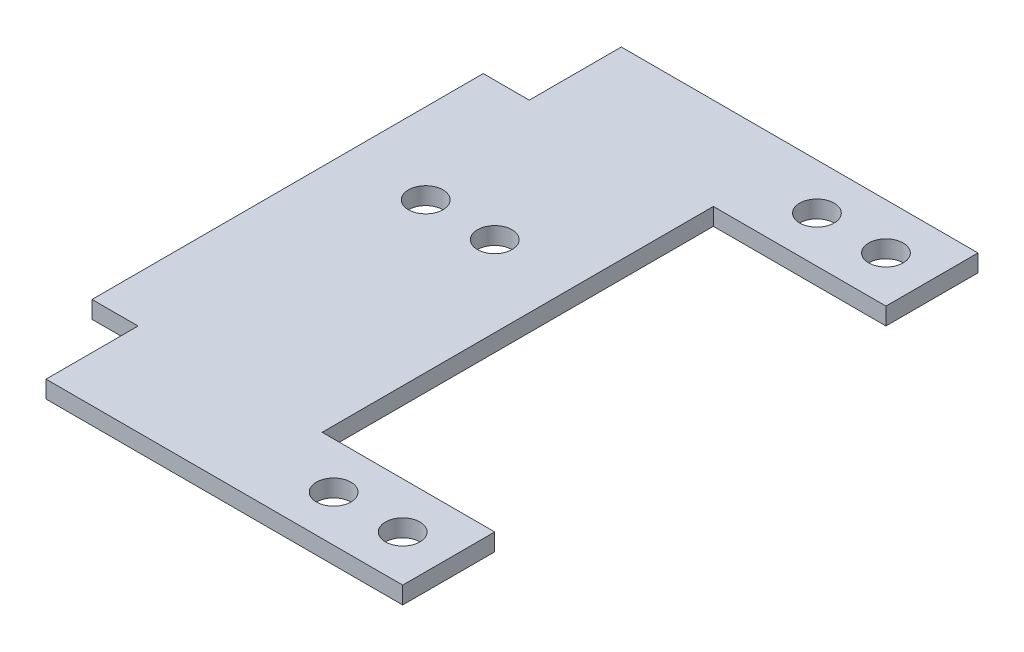
ISO-10303-21;
HEADER;
FILE_DESCRIPTION(('STEP AP214'),'2;1');
FILE_NAME('part.step','',(''),(''),'','','');
FILE_SCHEMA(('AUTOMOTIVE_DESIGN { 1 0 10303 214 1 1 1 1 }'));
ENDSEC;
DATA;
#1=APPLICATION_CONTEXT('core data for automotive mechanical design processes');
#2=APPLICATION_PROTOCOL_DEFINITION('international standard','automotive_design',2000,#1);
#3=PRODUCT_CONTEXT('',#1,'mechanical');
#4=PRODUCT('Part','Part','',(#3));
#5=PRODUCT_RELATED_PRODUCT_CATEGORY('part','',(#4));
#6=PRODUCT_DEFINITION_FORMATION('','',#4);
#7=PRODUCT_DEFINITION_CONTEXT('part definition',#1,'design');
#8=PRODUCT_DEFINITION('design','',#6,#7);
#9=PRODUCT_DEFINITION_SHAPE('','',#8);
#10=(LENGTH_UNIT() NAMED_UNIT(*) SI_UNIT(.MILLI.,.METRE.));
#11=(NAMED_UNIT(*) PLANE_ANGLE_UNIT() SI_UNIT($,.RADIAN.));
#12=(NAMED_UNIT(*) SI_UNIT($,.STERADIAN.) SOLID_ANGLE_UNIT());
#13=UNCERTAINTY_MEASURE_WITH_UNIT(LENGTH_MEASURE(1.E-05),#10,'distance_accuracy_value','');
#14=(GEOMETRIC_REPRESENTATION_CONTEXT(3) GLOBAL_UNCERTAINTY_ASSIGNED_CONTEXT((#13)) GLOBAL_UNIT_ASSIGNED_CONTEXT((#10,
#11,#12)) REPRESENTATION_CONTEXT('',''));
#15=CARTESIAN_POINT('',(0.,0.,0.));
#16=DIRECTION('',(0.,0.,1.));
#17=DIRECTION('',(1.,0.,0.));
#18=AXIS2_PLACEMENT_3D('',#15,#16,#17);
#19=CARTESIAN_POINT('',(-10.,1.5,-17.));
#20=DIRECTION('',(0.,0.,1.));
#21=DIRECTION('',(1.,0.,0.));
#22=AXIS2_PLACEMENT_3D('',#19,#20,#21);
#23=PLANE('',#22);
#24=DIRECTION('',(0.,1.,0.));
#25=VECTOR('',#24,1.);
#26=CARTESIAN_POINT('',(-6.,0.,-17.));
#27=LINE('',#26,#25);
#28=CARTESIAN_POINT('',(-6.,0.,-17.));
#29=VERTEX_POINT('',#28);
#30=CARTESIAN_POINT('',(-6.,1.5,-17.));
#31=VERTEX_POINT('',#30);
#32=EDGE_CURVE('E56',#29,#31,#27,.T.);
#33=ORIENTED_EDGE('',*,*,#32,.F.);
#34=DIRECTION('',(-1.,0.,0.));
#35=VECTOR('',#34,1.);
#36=CARTESIAN_POINT('',(-10.,0.,-17.));
#37=LINE('',#36,#35);
#38=CARTESIAN_POINT('',(-10.,0.,-17.));
#39=VERTEX_POINT('',#38);
#40=EDGE_CURVE('E150',#29,#39,#37,.T.);
#41=ORIENTED_EDGE('',*,*,#40,.T.);
#42=DIRECTION('',(0.,-1.,0.));
#43=VECTOR('',#42,1.);
#44=CARTESIAN_POINT('',(-10.,1.5,-17.));
#45=LINE('',#44,#43);
#46=CARTESIAN_POINT('',(-10.,1.5,-17.));
#47=VERTEX_POINT('',#46);
#48=EDGE_CURVE('E48',#47,#39,#45,.T.);
#49=ORIENTED_EDGE('',*,*,#48,.F.);
#50=DIRECTION('',(-1.,0.,0.));
#51=VECTOR('',#50,1.);
#52=CARTESIAN_POINT('',(-10.,1.5,-17.));
#53=LINE('',#52,#51);
#54=EDGE_CURVE('E208',#31,#47,#53,.T.);
#55=ORIENTED_EDGE('',*,*,#54,.F.);
#56=EDGE_LOOP('',(#33,#41,#49,#55));
#57=FACE_BOUND('',#56,.T.);
#58=ADVANCED_FACE('F39',(#57),#23,.F.);
#59=CARTESIAN_POINT('',(9.99999999999999,1.5,-17.));
#60=DIRECTION('',(-1.,0.,0.));
#61=DIRECTION('',(0.,0.,1.));
#62=AXIS2_PLACEMENT_3D('',#59,#60,#61);
#63=PLANE('',#62);
#64=DIRECTION('',(0.,0.,-1.));
#65=VECTOR('',#64,1.);
#66=CARTESIAN_POINT('',(9.99999999999999,0.,-17.));
#67=LINE('',#66,#65);
#68=CARTESIAN_POINT('',(10.,0.,17.));
#69=VERTEX_POINT('',#68);
#70=CARTESIAN_POINT('',(9.99999999999999,0.,-17.));
#71=VERTEX_POINT('',#70);
#72=EDGE_CURVE('E200',#69,#71,#67,.T.);
#73=ORIENTED_EDGE('',*,*,#72,.T.);
#74=DIRECTION('',(0.,-1.,0.));
#75=VECTOR('',#74,1.);
#76=CARTESIAN_POINT('',(9.99999999999999,1.5,-17.));
#77=LINE('',#76,#75);
#78=CARTESIAN_POINT('',(9.99999999999999,1.5,-17.));
#79=VERTEX_POINT('',#78);
#80=EDGE_CURVE('E11',#79,#71,#77,.T.);
#81=ORIENTED_EDGE('',*,*,#80,.F.);
#82=DIRECTION('',(0.,0.,-1.));
#83=VECTOR('',#82,1.);
#84=CARTESIAN_POINT('',(9.99999999999999,1.5,-17.));
#85=LINE('',#84,#83);
#86=CARTESIAN_POINT('',(10.,1.5,17.));
#87=VERTEX_POINT('',#86);
#88=EDGE_CURVE('E206',#87,#79,#85,.T.);
#89=ORIENTED_EDGE('',*,*,#88,.F.);
#90=DIRECTION('',(0.,-1.,0.));
#91=VECTOR('',#90,1.);
#92=CARTESIAN_POINT('',(10.,1.5,17.));
#93=LINE('',#92,#91);
#94=EDGE_CURVE('E216',#87,#69,#93,.T.);
#95=ORIENTED_EDGE('',*,*,#94,.T.);
#96=EDGE_LOOP('',(#73,#81,#89,#95));
#97=FACE_BOUND('',#96,.T.);
#98=ADVANCED_FACE('F41',(#97),#63,.F.);
#99=CARTESIAN_POINT('',(-10.,1.5,-17.));
#100=DIRECTION('',(1.,0.,0.));
#101=DIRECTION('',(0.,0.,-1.));
#102=AXIS2_PLACEMENT_3D('',#99,#100,#101);
#103=PLANE('',#102);
#104=DIRECTION('',(0.,0.,1.));
#105=VECTOR('',#104,1.);
#106=CARTESIAN_POINT('',(-10.,0.,-17.));
#107=LINE('',#106,#105);
#108=CARTESIAN_POINT('',(-10.,0.,17.));
#109=VERTEX_POINT('',#108);
#110=EDGE_CURVE('E219',#39,#109,#107,.T.);
#111=ORIENTED_EDGE('',*,*,#110,.T.);
#112=DIRECTION('',(0.,-1.,0.));
#113=VECTOR('',#112,1.);
#114=CARTESIAN_POINT('',(-10.,1.5,17.));
#115=LINE('',#114,#113);
#116=CARTESIAN_POINT('',(-10.,1.5,17.));
#117=VERTEX_POINT('',#116);
#118=EDGE_CURVE('E225',#117,#109,#115,.T.);
#119=ORIENTED_EDGE('',*,*,#118,.F.);
#120=DIRECTION('',(0.,0.,1.));
#121=VECTOR('',#120,1.);
#122=CARTESIAN_POINT('',(-10.,1.5,-17.));
#123=LINE('',#122,#121);
#124=EDGE_CURVE('E211',#47,#117,#123,.T.);
#125=ORIENTED_EDGE('',*,*,#124,.F.);
#126=ORIENTED_EDGE('',*,*,#48,.T.);
#127=EDGE_LOOP('',(#111,#119,#125,#126));
#128=FACE_BOUND('',#127,.T.);
#129=ADVANCED_FACE('F297',(#128),#103,.F.);
#130=CARTESIAN_POINT('',(-10.,1.5,17.));
#131=DIRECTION('',(0.,0.,-1.));
#132=DIRECTION('',(-1.,0.,0.));
#133=AXIS2_PLACEMENT_3D('',#130,#131,#132);
#134=PLANE('',#133);
#135=DIRECTION('',(1.,0.,0.));
#136=VECTOR('',#135,1.);
#137=CARTESIAN_POINT('',(-10.,0.,17.));
#138=LINE('',#137,#136);
#139=CARTESIAN_POINT('',(-6.,0.,17.));
#140=VERTEX_POINT('',#139);
#141=EDGE_CURVE('E209',#109,#140,#138,.T.);
#142=ORIENTED_EDGE('',*,*,#141,.T.);
#143=DIRECTION('',(0.,1.,0.));
#144=VECTOR('',#143,1.);
#145=CARTESIAN_POINT('',(-6.,0.,17.));
#146=LINE('',#145,#144);
#147=CARTESIAN_POINT('',(-6.,1.5,17.));
#148=VERTEX_POINT('',#147);
#149=EDGE_CURVE('E189',#140,#148,#146,.T.);
#150=ORIENTED_EDGE('',*,*,#149,.T.);
#151=DIRECTION('',(1.,0.,0.));
#152=VECTOR('',#151,1.);
#153=CARTESIAN_POINT('',(-10.,1.5,17.));
#154=LINE('',#153,#152);
#155=EDGE_CURVE('E213',#117,#148,#154,.T.);
#156=ORIENTED_EDGE('',*,*,#155,.F.);
#157=ORIENTED_EDGE('',*,*,#118,.T.);
#158=EDGE_LOOP('',(#142,#150,#156,#157));
#159=FACE_BOUND('',#158,.T.);
#160=ADVANCED_FACE('F274',(#159),#134,.F.);
#161=CARTESIAN_POINT('',(0.,1.5,0.));
#162=DIRECTION('',(0.,1.,0.));
#163=DIRECTION('',(0.,0.,1.));
#164=AXIS2_PLACEMENT_3D('',#161,#162,#163);
#165=PLANE('',#164);
#166=CARTESIAN_POINT('',(21.,1.5,21.));
#167=DIRECTION('',(0.,1.,0.));
#168=DIRECTION('',(0.,0.,1.));
#169=AXIS2_PLACEMENT_3D('',#166,#167,#168);
#170=CIRCLE('',#169,1.5);
#171=CARTESIAN_POINT('',(21.,1.5,22.5));
#172=VERTEX_POINT('',#171);
#173=EDGE_CURVE('E259',#172,#172,#170,.T.);
#174=ORIENTED_EDGE('',*,*,#173,.F.);
#175=EDGE_LOOP('',(#174));
#176=FACE_BOUND('',#175,.T.);
#177=CARTESIAN_POINT('',(15.,1.5,21.));
#178=DIRECTION('',(0.,1.,0.));
#179=DIRECTION('',(0.,0.,1.));
#180=AXIS2_PLACEMENT_3D('',#177,#178,#179);
#181=CIRCLE('',#180,1.5);
#182=CARTESIAN_POINT('',(15.,1.5,22.5));
#183=VERTEX_POINT('',#182);
#184=EDGE_CURVE('E262',#183,#183,#181,.T.);
#185=ORIENTED_EDGE('',*,*,#184,.F.);
#186=EDGE_LOOP('',(#185));
#187=FACE_BOUND('',#186,.T.);
#188=CARTESIAN_POINT('',(15.,1.5,-21.));
#189=DIRECTION('',(0.,1.,0.));
#190=DIRECTION('',(0.,0.,1.));
#191=AXIS2_PLACEMENT_3D('',#188,#189,#190);
#192=CIRCLE('',#191,1.5);
#193=CARTESIAN_POINT('',(15.,1.5,-19.5));
#194=VERTEX_POINT('',#193);
#195=EDGE_CURVE('E258',#194,#194,#192,.T.);
#196=ORIENTED_EDGE('',*,*,#195,.F.);
#197=EDGE_LOOP('',(#196));
#198=FACE_BOUND('',#197,.T.);
#199=CARTESIAN_POINT('',(21.,1.5,-21.));
#200=DIRECTION('',(0.,1.,0.));
#201=DIRECTION('',(0.,0.,1.));
#202=AXIS2_PLACEMENT_3D('',#199,#200,#201);
#203=CIRCLE('',#202,1.5);
#204=CARTESIAN_POINT('',(21.,1.5,-19.5));
#205=VERTEX_POINT('',#204);
#206=EDGE_CURVE('E240',#205,#205,#203,.T.);
#207=ORIENTED_EDGE('',*,*,#206,.F.);
#208=EDGE_LOOP('',(#207));
#209=FACE_BOUND('',#208,.T.);
#210=CARTESIAN_POINT('',(-3.,1.5,-5.));
#211=DIRECTION('',(0.,1.,0.));
#212=DIRECTION('',(0.,0.,1.));
#213=AXIS2_PLACEMENT_3D('',#210,#211,#212);
#214=CIRCLE('',#213,1.5);
#215=CARTESIAN_POINT('',(-3.,1.5,-3.5));
#216=VERTEX_POINT('',#215);
#217=EDGE_CURVE('E233',#216,#216,#214,.T.);
#218=ORIENTED_EDGE('',*,*,#217,.F.);
#219=EDGE_LOOP('',(#218));
#220=FACE_BOUND('',#219,.T.);
#221=CARTESIAN_POINT('',(3.,1.5,-5.));
#222=DIRECTION('',(0.,1.,0.));
#223=DIRECTION('',(0.,0.,1.));
#224=AXIS2_PLACEMENT_3D('',#221,#222,#223);
#225=CIRCLE('',#224,1.5);
#226=CARTESIAN_POINT('',(3.,1.5,-3.5));
#227=VERTEX_POINT('',#226);
#228=EDGE_CURVE('E161',#227,#227,#225,.T.);
#229=ORIENTED_EDGE('',*,*,#228,.F.);
#230=EDGE_LOOP('',(#229));
#231=FACE_BOUND('',#230,.T.);
#232=ORIENTED_EDGE('',*,*,#88,.T.);
#233=DIRECTION('',(1.,0.,0.));
#234=VECTOR('',#233,1.);
#235=CARTESIAN_POINT('',(-6.,1.5,-17.));
#236=LINE('',#235,#234);
#237=CARTESIAN_POINT('',(25.,1.5,-17.));
#238=VERTEX_POINT('',#237);
#239=EDGE_CURVE('E158',#79,#238,#236,.T.);
#240=ORIENTED_EDGE('',*,*,#239,.T.);
#241=DIRECTION('',(0.,0.,-1.));
#242=VECTOR('',#241,1.);
#243=CARTESIAN_POINT('',(25.,1.5,-25.));
#244=LINE('',#243,#242);
#245=CARTESIAN_POINT('',(25.,1.5,-25.));
#246=VERTEX_POINT('',#245);
#247=EDGE_CURVE('E155',#238,#246,#244,.T.);
#248=ORIENTED_EDGE('',*,*,#247,.T.);
#249=DIRECTION('',(-1.,0.,0.));
#250=VECTOR('',#249,1.);
#251=CARTESIAN_POINT('',(-6.,1.5,-25.));
#252=LINE('',#251,#250);
#253=CARTESIAN_POINT('',(-6.,1.5,-25.));
#254=VERTEX_POINT('',#253);
#255=EDGE_CURVE('E166',#246,#254,#252,.T.);
#256=ORIENTED_EDGE('',*,*,#255,.T.);
#257=DIRECTION('',(0.,0.,1.));
#258=VECTOR('',#257,1.);
#259=CARTESIAN_POINT('',(-6.,1.5,-17.));
#260=LINE('',#259,#258);
#261=EDGE_CURVE('E135',#254,#31,#260,.T.);
#262=ORIENTED_EDGE('',*,*,#261,.T.);
#263=ORIENTED_EDGE('',*,*,#54,.T.);
#264=ORIENTED_EDGE('',*,*,#124,.T.);
#265=ORIENTED_EDGE('',*,*,#155,.T.);
#266=DIRECTION('',(0.,0.,1.));
#267=VECTOR('',#266,1.);
#268=CARTESIAN_POINT('',(-6.,1.5,17.));
#269=LINE('',#268,#267);
#270=CARTESIAN_POINT('',(-6.,1.5,25.));
#271=VERTEX_POINT('',#270);
#272=EDGE_CURVE('E64',#148,#271,#269,.T.);
#273=ORIENTED_EDGE('',*,*,#272,.T.);
#274=DIRECTION('',(1.,0.,0.));
#275=VECTOR('',#274,1.);
#276=CARTESIAN_POINT('',(-6.,1.5,25.));
#277=LINE('',#276,#275);
#278=CARTESIAN_POINT('',(25.,1.5,25.));
#279=VERTEX_POINT('',#278);
#280=EDGE_CURVE('E193',#271,#279,#277,.T.);
#281=ORIENTED_EDGE('',*,*,#280,.T.);
#282=DIRECTION('',(0.,0.,-1.));
#283=VECTOR('',#282,1.);
#284=CARTESIAN_POINT('',(25.,1.5,25.));
#285=LINE('',#284,#283);
#286=CARTESIAN_POINT('',(25.,1.5,17.));
#287=VERTEX_POINT('',#286);
#288=EDGE_CURVE('E180',#279,#287,#285,.T.);
#289=ORIENTED_EDGE('',*,*,#288,.T.);
#290=DIRECTION('',(-1.,0.,0.));
#291=VECTOR('',#290,1.);
#292=CARTESIAN_POINT('',(-6.,1.5,17.));
#293=LINE('',#292,#291);
#294=EDGE_CURVE('E172',#287,#87,#293,.T.);
#295=ORIENTED_EDGE('',*,*,#294,.T.);
#296=EDGE_LOOP('',(#232,#240,#248,#256,#262,#263,#264,#265,#273,#281,#289,#295));
#297=FACE_BOUND('',#296,.T.);
#298=ADVANCED_FACE('F271',(#176,#187,#198,#209,#220,#231,#297),#165,.T.);
#299=CARTESIAN_POINT('',(0.,0.,0.));
#300=DIRECTION('',(0.,1.,0.));
#301=DIRECTION('',(0.,0.,1.));
#302=AXIS2_PLACEMENT_3D('',#299,#300,#301);
#303=PLANE('',#302);
#304=CARTESIAN_POINT('',(21.,0.,21.));
#305=DIRECTION('',(0.,1.,0.));
#306=DIRECTION('',(0.,0.,1.));
#307=AXIS2_PLACEMENT_3D('',#304,#305,#306);
#308=CIRCLE('',#307,1.5);
#309=CARTESIAN_POINT('',(21.,0.,22.5));
#310=VERTEX_POINT('',#309);
#311=EDGE_CURVE('E43',#310,#310,#308,.T.);
#312=ORIENTED_EDGE('',*,*,#311,.T.);
#313=EDGE_LOOP('',(#312));
#314=FACE_BOUND('',#313,.T.);
#315=CARTESIAN_POINT('',(15.,0.,21.));
#316=DIRECTION('',(0.,1.,0.));
#317=DIRECTION('',(0.,0.,1.));
#318=AXIS2_PLACEMENT_3D('',#315,#316,#317);
#319=CIRCLE('',#318,1.5);
#320=CARTESIAN_POINT('',(15.,0.,22.5));
#321=VERTEX_POINT('',#320);
#322=EDGE_CURVE('E242',#321,#321,#319,.T.);
#323=ORIENTED_EDGE('',*,*,#322,.T.);
#324=EDGE_LOOP('',(#323));
#325=FACE_BOUND('',#324,.T.);
#326=CARTESIAN_POINT('',(15.,0.,-21.));
#327=DIRECTION('',(0.,1.,0.));
#328=DIRECTION('',(0.,0.,1.));
#329=AXIS2_PLACEMENT_3D('',#326,#327,#328);
#330=CIRCLE('',#329,1.5);
#331=CARTESIAN_POINT('',(15.,0.,-19.5));
#332=VERTEX_POINT('',#331);
#333=EDGE_CURVE('E239',#332,#332,#330,.T.);
#334=ORIENTED_EDGE('',*,*,#333,.T.);
#335=EDGE_LOOP('',(#334));
#336=FACE_BOUND('',#335,.T.);
#337=CARTESIAN_POINT('',(21.,0.,-21.));
#338=DIRECTION('',(0.,1.,0.));
#339=DIRECTION('',(0.,0.,1.));
#340=AXIS2_PLACEMENT_3D('',#337,#338,#339);
#341=CIRCLE('',#340,1.5);
#342=CARTESIAN_POINT('',(21.,0.,-19.5));
#343=VERTEX_POINT('',#342);
#344=EDGE_CURVE('E236',#343,#343,#341,.T.);
#345=ORIENTED_EDGE('',*,*,#344,.T.);
#346=EDGE_LOOP('',(#345));
#347=FACE_BOUND('',#346,.T.);
#348=CARTESIAN_POINT('',(-3.,0.,-5.));
#349=DIRECTION('',(0.,1.,0.));
#350=DIRECTION('',(0.,0.,1.));
#351=AXIS2_PLACEMENT_3D('',#348,#349,#350);
#352=CIRCLE('',#351,1.5);
#353=CARTESIAN_POINT('',(-3.,0.,-3.5));
#354=VERTEX_POINT('',#353);
#355=EDGE_CURVE('E168',#354,#354,#352,.T.);
#356=ORIENTED_EDGE('',*,*,#355,.T.);
#357=EDGE_LOOP('',(#356));
#358=FACE_BOUND('',#357,.T.);
#359=CARTESIAN_POINT('',(3.,0.,-5.));
#360=DIRECTION('',(0.,1.,0.));
#361=DIRECTION('',(0.,0.,1.));
#362=AXIS2_PLACEMENT_3D('',#359,#360,#361);
#363=CIRCLE('',#362,1.5);
#364=CARTESIAN_POINT('',(3.,0.,-3.5));
#365=VERTEX_POINT('',#364);
#366=EDGE_CURVE('E230',#365,#365,#363,.T.);
#367=ORIENTED_EDGE('',*,*,#366,.T.);
#368=EDGE_LOOP('',(#367));
#369=FACE_BOUND('',#368,.T.);
#370=ORIENTED_EDGE('',*,*,#72,.F.);
#371=DIRECTION('',(-1.,0.,0.));
#372=VECTOR('',#371,1.);
#373=CARTESIAN_POINT('',(-6.,0.,17.));
#374=LINE('',#373,#372);
#375=CARTESIAN_POINT('',(25.,0.,17.));
#376=VERTEX_POINT('',#375);
#377=EDGE_CURVE('E177',#376,#69,#374,.T.);
#378=ORIENTED_EDGE('',*,*,#377,.F.);
#379=DIRECTION('',(0.,0.,-1.));
#380=VECTOR('',#379,1.);
#381=CARTESIAN_POINT('',(25.,0.,25.));
#382=LINE('',#381,#380);
#383=CARTESIAN_POINT('',(25.,0.,25.));
#384=VERTEX_POINT('',#383);
#385=EDGE_CURVE('E186',#384,#376,#382,.T.);
#386=ORIENTED_EDGE('',*,*,#385,.F.);
#387=DIRECTION('',(1.,0.,0.));
#388=VECTOR('',#387,1.);
#389=CARTESIAN_POINT('',(-6.,0.,25.));
#390=LINE('',#389,#388);
#391=CARTESIAN_POINT('',(-6.,0.,25.));
#392=VERTEX_POINT('',#391);
#393=EDGE_CURVE('E183',#392,#384,#390,.T.);
#394=ORIENTED_EDGE('',*,*,#393,.F.);
#395=DIRECTION('',(0.,0.,1.));
#396=VECTOR('',#395,1.);
#397=CARTESIAN_POINT('',(-6.,0.,17.));
#398=LINE('',#397,#396);
#399=EDGE_CURVE('E179',#140,#392,#398,.T.);
#400=ORIENTED_EDGE('',*,*,#399,.F.);
#401=ORIENTED_EDGE('',*,*,#141,.F.);
#402=ORIENTED_EDGE('',*,*,#110,.F.);
#403=ORIENTED_EDGE('',*,*,#40,.F.);
#404=DIRECTION('',(0.,0.,1.));
#405=VECTOR('',#404,1.);
#406=CARTESIAN_POINT('',(-6.,0.,-17.));
#407=LINE('',#406,#405);
#408=CARTESIAN_POINT('',(-6.,0.,-25.));
#409=VERTEX_POINT('',#408);
#410=EDGE_CURVE('E133',#409,#29,#407,.T.);
#411=ORIENTED_EDGE('',*,*,#410,.F.);
#412=DIRECTION('',(-1.,0.,0.));
#413=VECTOR('',#412,1.);
#414=CARTESIAN_POINT('',(-6.,0.,-25.));
#415=LINE('',#414,#413);
#416=CARTESIAN_POINT('',(25.,0.,-25.));
#417=VERTEX_POINT('',#416);
#418=EDGE_CURVE('E147',#417,#409,#415,.T.);
#419=ORIENTED_EDGE('',*,*,#418,.F.);
#420=DIRECTION('',(0.,0.,-1.));
#421=VECTOR('',#420,1.);
#422=CARTESIAN_POINT('',(25.,0.,-25.));
#423=LINE('',#422,#421);
#424=CARTESIAN_POINT('',(25.,0.,-17.));
#425=VERTEX_POINT('',#424);
#426=EDGE_CURVE('E140',#425,#417,#423,.T.);
#427=ORIENTED_EDGE('',*,*,#426,.F.);
#428=DIRECTION('',(1.,0.,0.));
#429=VECTOR('',#428,1.);
#430=CARTESIAN_POINT('',(-6.,0.,-17.));
#431=LINE('',#430,#429);
#432=EDGE_CURVE('E151',#71,#425,#431,.T.);
#433=ORIENTED_EDGE('',*,*,#432,.F.);
#434=EDGE_LOOP('',(#370,#378,#386,#394,#400,#401,#402,#403,#411,#419,#427,#433));
#435=FACE_BOUND('',#434,.T.);
#436=ADVANCED_FACE('F145',(#314,#325,#336,#347,#358,#369,#435),#303,.F.);
#437=CARTESIAN_POINT('',(-6.,0.,17.));
#438=DIRECTION('',(0.,0.,-1.));
#439=DIRECTION('',(-1.,0.,0.));
#440=AXIS2_PLACEMENT_3D('',#437,#438,#439);
#441=PLANE('',#440);
#442=ORIENTED_EDGE('',*,*,#94,.F.);
#443=ORIENTED_EDGE('',*,*,#294,.F.);
#444=DIRECTION('',(0.,1.,0.));
#445=VECTOR('',#444,1.);
#446=CARTESIAN_POINT('',(25.,0.,17.));
#447=LINE('',#446,#445);
#448=EDGE_CURVE('E198',#376,#287,#447,.T.);
#449=ORIENTED_EDGE('',*,*,#448,.F.);
#450=ORIENTED_EDGE('',*,*,#377,.T.);
#451=EDGE_LOOP('',(#442,#443,#449,#450));
#452=FACE_BOUND('',#451,.T.);
#453=ADVANCED_FACE('F309',(#452),#441,.T.);
#454=CARTESIAN_POINT('',(25.,0.,25.));
#455=DIRECTION('',(1.,0.,0.));
#456=DIRECTION('',(0.,0.,-1.));
#457=AXIS2_PLACEMENT_3D('',#454,#455,#456);
#458=PLANE('',#457);
#459=ORIENTED_EDGE('',*,*,#288,.F.);
#460=DIRECTION('',(0.,1.,0.));
#461=VECTOR('',#460,1.);
#462=CARTESIAN_POINT('',(25.,0.,25.));
#463=LINE('',#462,#461);
#464=EDGE_CURVE('E201',#384,#279,#463,.T.);
#465=ORIENTED_EDGE('',*,*,#464,.F.);
#466=ORIENTED_EDGE('',*,*,#385,.T.);
#467=ORIENTED_EDGE('',*,*,#448,.T.);
#468=EDGE_LOOP('',(#459,#465,#466,#467));
#469=FACE_BOUND('',#468,.T.);
#470=ADVANCED_FACE('F305',(#469),#458,.T.);
#471=CARTESIAN_POINT('',(-6.,0.,25.));
#472=DIRECTION('',(0.,0.,1.));
#473=DIRECTION('',(1.,0.,0.));
#474=AXIS2_PLACEMENT_3D('',#471,#472,#473);
#475=PLANE('',#474);
#476=ORIENTED_EDGE('',*,*,#280,.F.);
#477=DIRECTION('',(0.,1.,0.));
#478=VECTOR('',#477,1.);
#479=CARTESIAN_POINT('',(-6.,0.,25.));
#480=LINE('',#479,#478);
#481=EDGE_CURVE('E203',#392,#271,#480,.T.);
#482=ORIENTED_EDGE('',*,*,#481,.F.);
#483=ORIENTED_EDGE('',*,*,#393,.T.);
#484=ORIENTED_EDGE('',*,*,#464,.T.);
#485=EDGE_LOOP('',(#476,#482,#483,#484));
#486=FACE_BOUND('',#485,.T.);
#487=ADVANCED_FACE('F313',(#486),#475,.T.);
#488=CARTESIAN_POINT('',(-6.,0.,17.));
#489=DIRECTION('',(-1.,0.,0.));
#490=DIRECTION('',(0.,0.,1.));
#491=AXIS2_PLACEMENT_3D('',#488,#489,#490);
#492=PLANE('',#491);
#493=ORIENTED_EDGE('',*,*,#272,.F.);
#494=ORIENTED_EDGE('',*,*,#149,.F.);
#495=ORIENTED_EDGE('',*,*,#399,.T.);
#496=ORIENTED_EDGE('',*,*,#481,.T.);
#497=EDGE_LOOP('',(#493,#494,#495,#496));
#498=FACE_BOUND('',#497,.T.);
#499=ADVANCED_FACE('F312',(#498),#492,.T.);
#500=CARTESIAN_POINT('',(-6.,0.,-25.));
#501=DIRECTION('',(0.,0.,-1.));
#502=DIRECTION('',(-1.,0.,0.));
#503=AXIS2_PLACEMENT_3D('',#500,#501,#502);
#504=PLANE('',#503);
#505=ORIENTED_EDGE('',*,*,#255,.F.);
#506=DIRECTION('',(0.,1.,0.));
#507=VECTOR('',#506,1.);
#508=CARTESIAN_POINT('',(25.,0.,-25.));
#509=LINE('',#508,#507);
#510=EDGE_CURVE('E154',#417,#246,#509,.T.);
#511=ORIENTED_EDGE('',*,*,#510,.F.);
#512=ORIENTED_EDGE('',*,*,#418,.T.);
#513=DIRECTION('',(0.,1.,0.));
#514=VECTOR('',#513,1.);
#515=CARTESIAN_POINT('',(-6.,0.,-25.));
#516=LINE('',#515,#514);
#517=EDGE_CURVE('E130',#409,#254,#516,.T.);
#518=ORIENTED_EDGE('',*,*,#517,.T.);
#519=EDGE_LOOP('',(#505,#511,#512,#518));
#520=FACE_BOUND('',#519,.T.);
#521=ADVANCED_FACE('F153',(#520),#504,.T.);
#522=CARTESIAN_POINT('',(25.,0.,-25.));
#523=DIRECTION('',(1.,0.,0.));
#524=DIRECTION('',(0.,0.,-1.));
#525=AXIS2_PLACEMENT_3D('',#522,#523,#524);
#526=PLANE('',#525);
#527=ORIENTED_EDGE('',*,*,#247,.F.);
#528=DIRECTION('',(0.,1.,0.));
#529=VECTOR('',#528,1.);
#530=CARTESIAN_POINT('',(25.,0.,-17.));
#531=LINE('',#530,#529);
#532=EDGE_CURVE('E173',#425,#238,#531,.T.);
#533=ORIENTED_EDGE('',*,*,#532,.F.);
#534=ORIENTED_EDGE('',*,*,#426,.T.);
#535=ORIENTED_EDGE('',*,*,#510,.T.);
#536=EDGE_LOOP('',(#527,#533,#534,#535));
#537=FACE_BOUND('',#536,.T.);
#538=ADVANCED_FACE('F292',(#537),#526,.T.);
#539=CARTESIAN_POINT('',(-6.,0.,-17.));
#540=DIRECTION('',(0.,0.,1.));
#541=DIRECTION('',(1.,0.,0.));
#542=AXIS2_PLACEMENT_3D('',#539,#540,#541);
#543=PLANE('',#542);
#544=ORIENTED_EDGE('',*,*,#239,.F.);
#545=ORIENTED_EDGE('',*,*,#80,.T.);
#546=ORIENTED_EDGE('',*,*,#432,.T.);
#547=ORIENTED_EDGE('',*,*,#532,.T.);
#548=EDGE_LOOP('',(#544,#545,#546,#547));
#549=FACE_BOUND('',#548,.T.);
#550=ADVANCED_FACE('F288',(#549),#543,.T.);
#551=CARTESIAN_POINT('',(-6.,0.,-17.));
#552=DIRECTION('',(-1.,0.,0.));
#553=DIRECTION('',(0.,0.,1.));
#554=AXIS2_PLACEMENT_3D('',#551,#552,#553);
#555=PLANE('',#554);
#556=ORIENTED_EDGE('',*,*,#261,.F.);
#557=ORIENTED_EDGE('',*,*,#517,.F.);
#558=ORIENTED_EDGE('',*,*,#410,.T.);
#559=ORIENTED_EDGE('',*,*,#32,.T.);
#560=EDGE_LOOP('',(#556,#557,#558,#559));
#561=FACE_BOUND('',#560,.T.);
#562=ADVANCED_FACE('F132',(#561),#555,.T.);
#563=CARTESIAN_POINT('',(3.,-8.5,-5.));
#564=DIRECTION('',(0.,1.,0.));
#565=DIRECTION('',(0.,0.,1.));
#566=AXIS2_PLACEMENT_3D('',#563,#564,#565);
#567=CYLINDRICAL_SURFACE('',#566,1.5);
#568=ORIENTED_EDGE('',*,*,#228,.T.);
#569=EDGE_LOOP('',(#568));
#570=FACE_BOUND('',#569,.T.);
#571=ORIENTED_EDGE('',*,*,#366,.F.);
#572=EDGE_LOOP('',(#571));
#573=FACE_BOUND('',#572,.T.);
#574=ADVANCED_FACE('F392',(#570,#573),#567,.F.);
#575=CARTESIAN_POINT('',(-3.,-8.5,-5.));
#576=DIRECTION('',(0.,1.,0.));
#577=DIRECTION('',(0.,0.,1.));
#578=AXIS2_PLACEMENT_3D('',#575,#576,#577);
#579=CYLINDRICAL_SURFACE('',#578,1.5);
#580=ORIENTED_EDGE('',*,*,#217,.T.);
#581=EDGE_LOOP('',(#580));
#582=FACE_BOUND('',#581,.T.);
#583=ORIENTED_EDGE('',*,*,#355,.F.);
#584=EDGE_LOOP('',(#583));
#585=FACE_BOUND('',#584,.T.);
#586=ADVANCED_FACE('F402',(#582,#585),#579,.F.);
#587=CARTESIAN_POINT('',(21.,-8.5,-21.));
#588=DIRECTION('',(0.,1.,0.));
#589=DIRECTION('',(0.,0.,1.));
#590=AXIS2_PLACEMENT_3D('',#587,#588,#589);
#591=CYLINDRICAL_SURFACE('',#590,1.5);
#592=ORIENTED_EDGE('',*,*,#206,.T.);
#593=EDGE_LOOP('',(#592));
#594=FACE_BOUND('',#593,.T.);
#595=ORIENTED_EDGE('',*,*,#344,.F.);
#596=EDGE_LOOP('',(#595));
#597=FACE_BOUND('',#596,.T.);
#598=ADVANCED_FACE('F412',(#594,#597),#591,.F.);
#599=CARTESIAN_POINT('',(15.,-8.5,-21.));
#600=DIRECTION('',(0.,1.,0.));
#601=DIRECTION('',(0.,0.,1.));
#602=AXIS2_PLACEMENT_3D('',#599,#600,#601);
#603=CYLINDRICAL_SURFACE('',#602,1.5);
#604=ORIENTED_EDGE('',*,*,#195,.T.);
#605=EDGE_LOOP('',(#604));
#606=FACE_BOUND('',#605,.T.);
#607=ORIENTED_EDGE('',*,*,#333,.F.);
#608=EDGE_LOOP('',(#607));
#609=FACE_BOUND('',#608,.T.);
#610=ADVANCED_FACE('F268',(#606,#609),#603,.F.);
#611=CARTESIAN_POINT('',(15.,-8.5,21.));
#612=DIRECTION('',(0.,1.,0.));
#613=DIRECTION('',(0.,0.,1.));
#614=AXIS2_PLACEMENT_3D('',#611,#612,#613);
#615=CYLINDRICAL_SURFACE('',#614,1.5);
#616=ORIENTED_EDGE('',*,*,#184,.T.);
#617=EDGE_LOOP('',(#616));
#618=FACE_BOUND('',#617,.T.);
#619=ORIENTED_EDGE('',*,*,#322,.F.);
#620=EDGE_LOOP('',(#619));
#621=FACE_BOUND('',#620,.T.);
#622=ADVANCED_FACE('F444',(#618,#621),#615,.F.);
#623=CARTESIAN_POINT('',(21.,-8.5,21.));
#624=DIRECTION('',(0.,1.,0.));
#625=DIRECTION('',(0.,0.,1.));
#626=AXIS2_PLACEMENT_3D('',#623,#624,#625);
#627=CYLINDRICAL_SURFACE('',#626,1.5);
#628=ORIENTED_EDGE('',*,*,#173,.T.);
#629=EDGE_LOOP('',(#628));
#630=FACE_BOUND('',#629,.T.);
#631=ORIENTED_EDGE('',*,*,#311,.F.);
#632=EDGE_LOOP('',(#631));
#633=FACE_BOUND('',#632,.T.);
#634=ADVANCED_FACE('F454',(#630,#633),#627,.F.);
#635=CLOSED_SHELL('',(#58,#98,#129,#160,#298,#436,#453,#470,#487,#499,#521,#538,#550,#562,#574,
#586,#598,#610,#622,#634));
#636=MANIFOLD_SOLID_BREP('B2',#635);
#637=ADVANCED_BREP_SHAPE_REPRESENTATION('',(#18,#636),#14);
#638=SHAPE_DEFINITION_REPRESENTATION(#9,#637);
ENDSEC;
END-ISO-10303-21;
